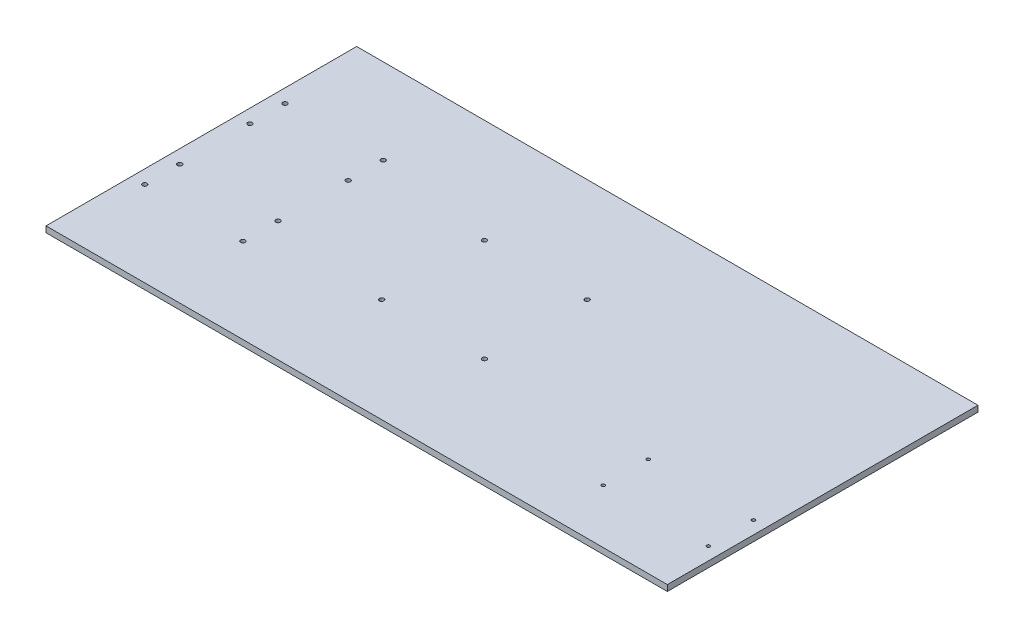
ISO-10303-21;
HEADER;
FILE_DESCRIPTION(('STEP AP214'),'2;1');
FILE_NAME('part.step','',(''),(''),'','','');
FILE_SCHEMA(('AUTOMOTIVE_DESIGN { 1 0 10303 214 1 1 1 1 }'));
ENDSEC;
DATA;
#1=APPLICATION_CONTEXT('core data for automotive mechanical design processes');
#2=APPLICATION_PROTOCOL_DEFINITION('international standard','automotive_design',2000,#1);
#3=PRODUCT_CONTEXT('',#1,'mechanical');
#4=PRODUCT('Part','Part','',(#3));
#5=PRODUCT_RELATED_PRODUCT_CATEGORY('part','',(#4));
#6=PRODUCT_DEFINITION_FORMATION('','',#4);
#7=PRODUCT_DEFINITION_CONTEXT('part definition',#1,'design');
#8=PRODUCT_DEFINITION('design','',#6,#7);
#9=PRODUCT_DEFINITION_SHAPE('','',#8);
#10=(LENGTH_UNIT() NAMED_UNIT(*) SI_UNIT(.MILLI.,.METRE.));
#11=(NAMED_UNIT(*) PLANE_ANGLE_UNIT() SI_UNIT($,.RADIAN.));
#12=(NAMED_UNIT(*) SI_UNIT($,.STERADIAN.) SOLID_ANGLE_UNIT());
#13=UNCERTAINTY_MEASURE_WITH_UNIT(LENGTH_MEASURE(1.E-05),#10,'distance_accuracy_value','');
#14=(GEOMETRIC_REPRESENTATION_CONTEXT(3) GLOBAL_UNCERTAINTY_ASSIGNED_CONTEXT((#13)) GLOBAL_UNIT_ASSIGNED_CONTEXT((#10,
#11,#12)) REPRESENTATION_CONTEXT('',''));
#15=CARTESIAN_POINT('',(0.,0.,0.));
#16=DIRECTION('',(0.,0.,1.));
#17=DIRECTION('',(1.,0.,0.));
#18=AXIS2_PLACEMENT_3D('',#15,#16,#17);
#19=CARTESIAN_POINT('',(-565.,12.,-310.));
#20=DIRECTION('',(1.,0.,0.));
#21=DIRECTION('',(0.,0.,-1.));
#22=AXIS2_PLACEMENT_3D('',#19,#20,#21);
#23=PLANE('',#22);
#24=DIRECTION('',(0.,0.,1.));
#25=VECTOR('',#24,1.);
#26=CARTESIAN_POINT('',(-565.,0.,-310.));
#27=LINE('',#26,#25);
#28=CARTESIAN_POINT('',(-565.,0.,-310.));
#29=VERTEX_POINT('',#28);
#30=CARTESIAN_POINT('',(-565.,0.,310.));
#31=VERTEX_POINT('',#30);
#32=EDGE_CURVE('E105',#29,#31,#27,.T.);
#33=ORIENTED_EDGE('',*,*,#32,.T.);
#34=DIRECTION('',(0.,-1.,0.));
#35=VECTOR('',#34,1.);
#36=CARTESIAN_POINT('',(-565.,12.,310.));
#37=LINE('',#36,#35);
#38=CARTESIAN_POINT('',(-565.,12.,310.));
#39=VERTEX_POINT('',#38);
#40=EDGE_CURVE('E11',#39,#31,#37,.T.);
#41=ORIENTED_EDGE('',*,*,#40,.F.);
#42=DIRECTION('',(0.,0.,1.));
#43=VECTOR('',#42,1.);
#44=CARTESIAN_POINT('',(-565.,12.,-310.));
#45=LINE('',#44,#43);
#46=CARTESIAN_POINT('',(-565.,12.,-310.));
#47=VERTEX_POINT('',#46);
#48=EDGE_CURVE('E92',#47,#39,#45,.T.);
#49=ORIENTED_EDGE('',*,*,#48,.F.);
#50=DIRECTION('',(0.,-1.,0.));
#51=VECTOR('',#50,1.);
#52=CARTESIAN_POINT('',(-565.,12.,-310.));
#53=LINE('',#52,#51);
#54=EDGE_CURVE('E101',#47,#29,#53,.T.);
#55=ORIENTED_EDGE('',*,*,#54,.T.);
#56=EDGE_LOOP('',(#33,#41,#49,#55));
#57=FACE_BOUND('',#56,.T.);
#58=ADVANCED_FACE('F39',(#57),#23,.F.);
#59=CARTESIAN_POINT('',(-565.,12.,310.));
#60=DIRECTION('',(0.,0.,-1.));
#61=DIRECTION('',(-1.,0.,0.));
#62=AXIS2_PLACEMENT_3D('',#59,#60,#61);
#63=PLANE('',#62);
#64=DIRECTION('',(1.,0.,0.));
#65=VECTOR('',#64,1.);
#66=CARTESIAN_POINT('',(-565.,0.,310.));
#67=LINE('',#66,#65);
#68=CARTESIAN_POINT('',(675.,0.,310.));
#69=VERTEX_POINT('',#68);
#70=EDGE_CURVE('E96',#31,#69,#67,.T.);
#71=ORIENTED_EDGE('',*,*,#70,.T.);
#72=DIRECTION('',(0.,-1.,0.));
#73=VECTOR('',#72,1.);
#74=CARTESIAN_POINT('',(675.,12.,310.));
#75=LINE('',#74,#73);
#76=CARTESIAN_POINT('',(675.,12.,310.));
#77=VERTEX_POINT('',#76);
#78=EDGE_CURVE('E48',#77,#69,#75,.T.);
#79=ORIENTED_EDGE('',*,*,#78,.F.);
#80=DIRECTION('',(1.,0.,0.));
#81=VECTOR('',#80,1.);
#82=CARTESIAN_POINT('',(-565.,12.,310.));
#83=LINE('',#82,#81);
#84=EDGE_CURVE('E87',#39,#77,#83,.T.);
#85=ORIENTED_EDGE('',*,*,#84,.F.);
#86=ORIENTED_EDGE('',*,*,#40,.T.);
#87=EDGE_LOOP('',(#71,#79,#85,#86));
#88=FACE_BOUND('',#87,.T.);
#89=ADVANCED_FACE('F95',(#88),#63,.F.);
#90=CARTESIAN_POINT('',(675.,12.,-310.));
#91=DIRECTION('',(-1.,0.,0.));
#92=DIRECTION('',(0.,0.,1.));
#93=AXIS2_PLACEMENT_3D('',#90,#91,#92);
#94=PLANE('',#93);
#95=DIRECTION('',(0.,0.,-1.));
#96=VECTOR('',#95,1.);
#97=CARTESIAN_POINT('',(675.,0.,-310.));
#98=LINE('',#97,#96);
#99=CARTESIAN_POINT('',(675.,0.,-310.));
#100=VERTEX_POINT('',#99);
#101=EDGE_CURVE('E74',#69,#100,#98,.T.);
#102=ORIENTED_EDGE('',*,*,#101,.T.);
#103=DIRECTION('',(0.,-1.,0.));
#104=VECTOR('',#103,1.);
#105=CARTESIAN_POINT('',(675.,12.,-310.));
#106=LINE('',#105,#104);
#107=CARTESIAN_POINT('',(675.,12.,-310.));
#108=VERTEX_POINT('',#107);
#109=EDGE_CURVE('E97',#108,#100,#106,.T.);
#110=ORIENTED_EDGE('',*,*,#109,.F.);
#111=DIRECTION('',(0.,0.,-1.));
#112=VECTOR('',#111,1.);
#113=CARTESIAN_POINT('',(675.,12.,-310.));
#114=LINE('',#113,#112);
#115=EDGE_CURVE('E90',#77,#108,#114,.T.);
#116=ORIENTED_EDGE('',*,*,#115,.F.);
#117=ORIENTED_EDGE('',*,*,#78,.T.);
#118=EDGE_LOOP('',(#102,#110,#116,#117));
#119=FACE_BOUND('',#118,.T.);
#120=ADVANCED_FACE('F99',(#119),#94,.F.);
#121=CARTESIAN_POINT('',(-565.,12.,-310.));
#122=DIRECTION('',(0.,0.,1.));
#123=DIRECTION('',(1.,0.,0.));
#124=AXIS2_PLACEMENT_3D('',#121,#122,#123);
#125=PLANE('',#124);
#126=DIRECTION('',(-1.,0.,0.));
#127=VECTOR('',#126,1.);
#128=CARTESIAN_POINT('',(-565.,0.,-310.));
#129=LINE('',#128,#127);
#130=EDGE_CURVE('E80',#100,#29,#129,.T.);
#131=ORIENTED_EDGE('',*,*,#130,.T.);
#132=ORIENTED_EDGE('',*,*,#54,.F.);
#133=DIRECTION('',(-1.,0.,0.));
#134=VECTOR('',#133,1.);
#135=CARTESIAN_POINT('',(-565.,12.,-310.));
#136=LINE('',#135,#134);
#137=EDGE_CURVE('E57',#108,#47,#136,.T.);
#138=ORIENTED_EDGE('',*,*,#137,.F.);
#139=ORIENTED_EDGE('',*,*,#109,.T.);
#140=EDGE_LOOP('',(#131,#132,#138,#139));
#141=FACE_BOUND('',#140,.T.);
#142=ADVANCED_FACE('F191',(#141),#125,.F.);
#143=CARTESIAN_POINT('',(0.,12.,0.));
#144=DIRECTION('',(0.,1.,0.));
#145=DIRECTION('',(0.,0.,1.));
#146=AXIS2_PLACEMENT_3D('',#143,#144,#145);
#147=PLANE('',#146);
#148=CARTESIAN_POINT('',(649.4,12.,202.513078806));
#149=DIRECTION('',(0.,1.,0.));
#150=DIRECTION('',(0.,0.,1.));
#151=AXIS2_PLACEMENT_3D('',#148,#149,#150);
#152=CIRCLE('',#151,3.29999999999998);
#153=CARTESIAN_POINT('',(649.4,12.,205.813078806));
#154=VERTEX_POINT('',#153);
#155=EDGE_CURVE('E377',#154,#154,#152,.T.);
#156=ORIENTED_EDGE('',*,*,#155,.F.);
#157=EDGE_LOOP('',(#156));
#158=FACE_BOUND('',#157,.T.);
#159=CARTESIAN_POINT('',(439.4,12.,112.513078806));
#160=DIRECTION('',(0.,1.,0.));
#161=DIRECTION('',(0.,0.,1.));
#162=AXIS2_PLACEMENT_3D('',#159,#160,#161);
#163=CIRCLE('',#162,3.30000000000003);
#164=CARTESIAN_POINT('',(439.4,12.,115.813078806));
#165=VERTEX_POINT('',#164);
#166=EDGE_CURVE('E381',#165,#165,#163,.T.);
#167=ORIENTED_EDGE('',*,*,#166,.F.);
#168=EDGE_LOOP('',(#167));
#169=FACE_BOUND('',#168,.T.);
#170=CARTESIAN_POINT('',(649.4,12.,112.513078806));
#171=DIRECTION('',(0.,1.,0.));
#172=DIRECTION('',(0.,0.,1.));
#173=AXIS2_PLACEMENT_3D('',#170,#171,#172);
#174=CIRCLE('',#173,3.29999999999998);
#175=CARTESIAN_POINT('',(649.4,12.,115.813078806));
#176=VERTEX_POINT('',#175);
#177=EDGE_CURVE('E392',#176,#176,#174,.T.);
#178=ORIENTED_EDGE('',*,*,#177,.F.);
#179=EDGE_LOOP('',(#178));
#180=FACE_BOUND('',#179,.T.);
#181=CARTESIAN_POINT('',(439.4,12.,202.513078806));
#182=DIRECTION('',(0.,1.,0.));
#183=DIRECTION('',(0.,0.,1.));
#184=AXIS2_PLACEMENT_3D('',#181,#182,#183);
#185=CIRCLE('',#184,3.30000000000003);
#186=CARTESIAN_POINT('',(439.4,12.,205.813078806));
#187=VERTEX_POINT('',#186);
#188=EDGE_CURVE('E378',#187,#187,#185,.T.);
#189=ORIENTED_EDGE('',*,*,#188,.F.);
#190=EDGE_LOOP('',(#189));
#191=FACE_BOUND('',#190,.T.);
#192=CARTESIAN_POINT('',(102.530483272049,12.,102.530483272049));
#193=DIRECTION('',(0.,1.,0.));
#194=DIRECTION('',(0.,0.,1.));
#195=AXIS2_PLACEMENT_3D('',#192,#193,#194);
#196=CIRCLE('',#195,4.5);
#197=CARTESIAN_POINT('',(102.530483272049,12.,107.030483272049));
#198=VERTEX_POINT('',#197);
#199=EDGE_CURVE('E136',#198,#198,#196,.T.);
#200=ORIENTED_EDGE('',*,*,#199,.F.);
#201=EDGE_LOOP('',(#200));
#202=FACE_BOUND('',#201,.T.);
#203=CARTESIAN_POINT('',(-102.530483272049,12.,102.530483272049));
#204=DIRECTION('',(0.,1.,0.));
#205=DIRECTION('',(0.,0.,1.));
#206=AXIS2_PLACEMENT_3D('',#203,#204,#205);
#207=CIRCLE('',#206,4.5);
#208=CARTESIAN_POINT('',(-102.530483272049,12.,107.030483272049));
#209=VERTEX_POINT('',#208);
#210=EDGE_CURVE('E124',#209,#209,#207,.T.);
#211=ORIENTED_EDGE('',*,*,#210,.F.);
#212=EDGE_LOOP('',(#211));
#213=FACE_BOUND('',#212,.T.);
#214=CARTESIAN_POINT('',(-102.530483272049,12.,-102.530483272049));
#215=DIRECTION('',(0.,1.,0.));
#216=DIRECTION('',(0.,0.,1.));
#217=AXIS2_PLACEMENT_3D('',#214,#215,#216);
#218=CIRCLE('',#217,4.5);
#219=CARTESIAN_POINT('',(-102.530483272049,12.,-98.0304832720494));
#220=VERTEX_POINT('',#219);
#221=EDGE_CURVE('E121',#220,#220,#218,.T.);
#222=ORIENTED_EDGE('',*,*,#221,.F.);
#223=EDGE_LOOP('',(#222));
#224=FACE_BOUND('',#223,.T.);
#225=CARTESIAN_POINT('',(102.530483272049,12.,-102.530483272049));
#226=DIRECTION('',(0.,1.,0.));
#227=DIRECTION('',(0.,0.,1.));
#228=AXIS2_PLACEMENT_3D('',#225,#226,#227);
#229=CIRCLE('',#228,4.5);
#230=CARTESIAN_POINT('',(102.530483272049,12.,-98.0304832720494));
#231=VERTEX_POINT('',#230);
#232=EDGE_CURVE('E117',#231,#231,#229,.T.);
#233=ORIENTED_EDGE('',*,*,#232,.F.);
#234=EDGE_LOOP('',(#233));
#235=FACE_BOUND('',#234,.T.);
#236=CARTESIAN_POINT('',(-342.,12.,-140.));
#237=DIRECTION('',(0.,1.,0.));
#238=DIRECTION('',(0.,0.,1.));
#239=AXIS2_PLACEMENT_3D('',#236,#237,#238);
#240=CIRCLE('',#239,4.5);
#241=CARTESIAN_POINT('',(-342.,12.,-135.5));
#242=VERTEX_POINT('',#241);
#243=EDGE_CURVE('E165',#242,#242,#240,.T.);
#244=ORIENTED_EDGE('',*,*,#243,.F.);
#245=EDGE_LOOP('',(#244));
#246=FACE_BOUND('',#245,.T.);
#247=CARTESIAN_POINT('',(-538.,12.,140.));
#248=DIRECTION('',(0.,1.,0.));
#249=DIRECTION('',(0.,0.,1.));
#250=AXIS2_PLACEMENT_3D('',#247,#248,#249);
#251=CIRCLE('',#250,4.49999999999995);
#252=CARTESIAN_POINT('',(-538.,12.,144.5));
#253=VERTEX_POINT('',#252);
#254=EDGE_CURVE('E158',#253,#253,#251,.T.);
#255=ORIENTED_EDGE('',*,*,#254,.F.);
#256=EDGE_LOOP('',(#255));
#257=FACE_BOUND('',#256,.T.);
#258=CARTESIAN_POINT('',(-538.,12.,70.));
#259=DIRECTION('',(0.,1.,0.));
#260=DIRECTION('',(0.,0.,1.));
#261=AXIS2_PLACEMENT_3D('',#258,#259,#260);
#262=CIRCLE('',#261,4.49999999999995);
#263=CARTESIAN_POINT('',(-538.,12.,74.5));
#264=VERTEX_POINT('',#263);
#265=EDGE_CURVE('E177',#264,#264,#262,.T.);
#266=ORIENTED_EDGE('',*,*,#265,.F.);
#267=EDGE_LOOP('',(#266));
#268=FACE_BOUND('',#267,.T.);
#269=CARTESIAN_POINT('',(-538.,12.,-70.));
#270=DIRECTION('',(0.,1.,0.));
#271=DIRECTION('',(0.,0.,1.));
#272=AXIS2_PLACEMENT_3D('',#269,#270,#271);
#273=CIRCLE('',#272,4.49999999999995);
#274=CARTESIAN_POINT('',(-538.,12.,-65.5000000000001));
#275=VERTEX_POINT('',#274);
#276=EDGE_CURVE('E170',#275,#275,#273,.T.);
#277=ORIENTED_EDGE('',*,*,#276,.F.);
#278=EDGE_LOOP('',(#277));
#279=FACE_BOUND('',#278,.T.);
#280=CARTESIAN_POINT('',(-342.,12.,-70.));
#281=DIRECTION('',(0.,1.,0.));
#282=DIRECTION('',(0.,0.,1.));
#283=AXIS2_PLACEMENT_3D('',#280,#281,#282);
#284=CIRCLE('',#283,4.5);
#285=CARTESIAN_POINT('',(-342.,12.,-65.5));
#286=VERTEX_POINT('',#285);
#287=EDGE_CURVE('E140',#286,#286,#284,.T.);
#288=ORIENTED_EDGE('',*,*,#287,.F.);
#289=EDGE_LOOP('',(#288));
#290=FACE_BOUND('',#289,.T.);
#291=CARTESIAN_POINT('',(-342.,12.,70.));
#292=DIRECTION('',(0.,1.,0.));
#293=DIRECTION('',(0.,0.,1.));
#294=AXIS2_PLACEMENT_3D('',#291,#292,#293);
#295=CIRCLE('',#294,4.5);
#296=CARTESIAN_POINT('',(-342.,12.,74.5));
#297=VERTEX_POINT('',#296);
#298=EDGE_CURVE('E147',#297,#297,#295,.T.);
#299=ORIENTED_EDGE('',*,*,#298,.F.);
#300=EDGE_LOOP('',(#299));
#301=FACE_BOUND('',#300,.T.);
#302=CARTESIAN_POINT('',(-342.,12.,140.));
#303=DIRECTION('',(0.,1.,0.));
#304=DIRECTION('',(0.,0.,1.));
#305=AXIS2_PLACEMENT_3D('',#302,#303,#304);
#306=CIRCLE('',#305,4.5);
#307=CARTESIAN_POINT('',(-342.,12.,144.5));
#308=VERTEX_POINT('',#307);
#309=EDGE_CURVE('E153',#308,#308,#306,.T.);
#310=ORIENTED_EDGE('',*,*,#309,.F.);
#311=EDGE_LOOP('',(#310));
#312=FACE_BOUND('',#311,.T.);
#313=CARTESIAN_POINT('',(-538.,12.,-140.));
#314=DIRECTION('',(0.,1.,0.));
#315=DIRECTION('',(0.,0.,1.));
#316=AXIS2_PLACEMENT_3D('',#313,#314,#315);
#317=CIRCLE('',#316,4.49999999999995);
#318=CARTESIAN_POINT('',(-538.,12.,-135.5));
#319=VERTEX_POINT('',#318);
#320=EDGE_CURVE('E173',#319,#319,#317,.T.);
#321=ORIENTED_EDGE('',*,*,#320,.F.);
#322=EDGE_LOOP('',(#321));
#323=FACE_BOUND('',#322,.T.);
#324=ORIENTED_EDGE('',*,*,#48,.T.);
#325=ORIENTED_EDGE('',*,*,#84,.T.);
#326=ORIENTED_EDGE('',*,*,#115,.T.);
#327=ORIENTED_EDGE('',*,*,#137,.T.);
#328=EDGE_LOOP('',(#324,#325,#326,#327));
#329=FACE_BOUND('',#328,.T.);
#330=ADVANCED_FACE('F88',(#158,#169,#180,#191,#202,#213,#224,#235,#246,#257,#268,#279,#290,#301,
#312,#323,#329),#147,.T.);
#331=CARTESIAN_POINT('',(0.,0.,0.));
#332=DIRECTION('',(0.,1.,0.));
#333=DIRECTION('',(0.,0.,1.));
#334=AXIS2_PLACEMENT_3D('',#331,#332,#333);
#335=PLANE('',#334);
#336=CARTESIAN_POINT('',(649.4,0.,202.513078806));
#337=DIRECTION('',(0.,1.,0.));
#338=DIRECTION('',(0.,0.,1.));
#339=AXIS2_PLACEMENT_3D('',#336,#337,#338);
#340=CIRCLE('',#339,3.29999999999998);
#341=CARTESIAN_POINT('',(649.4,0.,205.813078806));
#342=VERTEX_POINT('',#341);
#343=EDGE_CURVE('E375',#342,#342,#340,.T.);
#344=ORIENTED_EDGE('',*,*,#343,.T.);
#345=EDGE_LOOP('',(#344));
#346=FACE_BOUND('',#345,.T.);
#347=CARTESIAN_POINT('',(439.4,0.,112.513078806));
#348=DIRECTION('',(0.,1.,0.));
#349=DIRECTION('',(0.,0.,1.));
#350=AXIS2_PLACEMENT_3D('',#347,#348,#349);
#351=CIRCLE('',#350,3.30000000000003);
#352=CARTESIAN_POINT('',(439.4,0.,115.813078806));
#353=VERTEX_POINT('',#352);
#354=EDGE_CURVE('E389',#353,#353,#351,.T.);
#355=ORIENTED_EDGE('',*,*,#354,.T.);
#356=EDGE_LOOP('',(#355));
#357=FACE_BOUND('',#356,.T.);
#358=CARTESIAN_POINT('',(649.4,0.,112.513078806));
#359=DIRECTION('',(0.,1.,0.));
#360=DIRECTION('',(0.,0.,1.));
#361=AXIS2_PLACEMENT_3D('',#358,#359,#360);
#362=CIRCLE('',#361,3.29999999999998);
#363=CARTESIAN_POINT('',(649.4,0.,115.813078806));
#364=VERTEX_POINT('',#363);
#365=EDGE_CURVE('E384',#364,#364,#362,.T.);
#366=ORIENTED_EDGE('',*,*,#365,.T.);
#367=EDGE_LOOP('',(#366));
#368=FACE_BOUND('',#367,.T.);
#369=CARTESIAN_POINT('',(439.4,0.,202.513078806));
#370=DIRECTION('',(0.,1.,0.));
#371=DIRECTION('',(0.,0.,1.));
#372=AXIS2_PLACEMENT_3D('',#369,#370,#371);
#373=CIRCLE('',#372,3.30000000000003);
#374=CARTESIAN_POINT('',(439.4,0.,205.813078806));
#375=VERTEX_POINT('',#374);
#376=EDGE_CURVE('E118',#375,#375,#373,.T.);
#377=ORIENTED_EDGE('',*,*,#376,.T.);
#378=EDGE_LOOP('',(#377));
#379=FACE_BOUND('',#378,.T.);
#380=CARTESIAN_POINT('',(102.530483272049,0.,102.530483272049));
#381=DIRECTION('',(0.,1.,0.));
#382=DIRECTION('',(0.,0.,1.));
#383=AXIS2_PLACEMENT_3D('',#380,#381,#382);
#384=CIRCLE('',#383,4.5);
#385=CARTESIAN_POINT('',(102.530483272049,0.,107.030483272049));
#386=VERTEX_POINT('',#385);
#387=EDGE_CURVE('E42',#386,#386,#384,.T.);
#388=ORIENTED_EDGE('',*,*,#387,.T.);
#389=EDGE_LOOP('',(#388));
#390=FACE_BOUND('',#389,.T.);
#391=CARTESIAN_POINT('',(-102.530483272049,0.,102.530483272049));
#392=DIRECTION('',(0.,1.,0.));
#393=DIRECTION('',(0.,0.,1.));
#394=AXIS2_PLACEMENT_3D('',#391,#392,#393);
#395=CIRCLE('',#394,4.5);
#396=CARTESIAN_POINT('',(-102.530483272049,0.,107.030483272049));
#397=VERTEX_POINT('',#396);
#398=EDGE_CURVE('E122',#397,#397,#395,.T.);
#399=ORIENTED_EDGE('',*,*,#398,.T.);
#400=EDGE_LOOP('',(#399));
#401=FACE_BOUND('',#400,.T.);
#402=CARTESIAN_POINT('',(-102.530483272049,0.,-102.530483272049));
#403=DIRECTION('',(0.,1.,0.));
#404=DIRECTION('',(0.,0.,1.));
#405=AXIS2_PLACEMENT_3D('',#402,#403,#404);
#406=CIRCLE('',#405,4.5);
#407=CARTESIAN_POINT('',(-102.530483272049,0.,-98.0304832720494));
#408=VERTEX_POINT('',#407);
#409=EDGE_CURVE('E119',#408,#408,#406,.T.);
#410=ORIENTED_EDGE('',*,*,#409,.T.);
#411=EDGE_LOOP('',(#410));
#412=FACE_BOUND('',#411,.T.);
#413=CARTESIAN_POINT('',(102.530483272049,0.,-102.530483272049));
#414=DIRECTION('',(0.,1.,0.));
#415=DIRECTION('',(0.,0.,1.));
#416=AXIS2_PLACEMENT_3D('',#413,#414,#415);
#417=CIRCLE('',#416,4.5);
#418=CARTESIAN_POINT('',(102.530483272049,0.,-98.0304832720494));
#419=VERTEX_POINT('',#418);
#420=EDGE_CURVE('E114',#419,#419,#417,.T.);
#421=ORIENTED_EDGE('',*,*,#420,.T.);
#422=EDGE_LOOP('',(#421));
#423=FACE_BOUND('',#422,.T.);
#424=CARTESIAN_POINT('',(-342.,0.,-140.));
#425=DIRECTION('',(0.,1.,0.));
#426=DIRECTION('',(0.,0.,1.));
#427=AXIS2_PLACEMENT_3D('',#424,#425,#426);
#428=CIRCLE('',#427,4.5);
#429=CARTESIAN_POINT('',(-342.,0.,-135.5));
#430=VERTEX_POINT('',#429);
#431=EDGE_CURVE('E143',#430,#430,#428,.T.);
#432=ORIENTED_EDGE('',*,*,#431,.T.);
#433=EDGE_LOOP('',(#432));
#434=FACE_BOUND('',#433,.T.);
#435=CARTESIAN_POINT('',(-538.,0.,140.));
#436=DIRECTION('',(0.,1.,0.));
#437=DIRECTION('',(0.,0.,1.));
#438=AXIS2_PLACEMENT_3D('',#435,#436,#437);
#439=CIRCLE('',#438,4.49999999999995);
#440=CARTESIAN_POINT('',(-538.,0.,144.5));
#441=VERTEX_POINT('',#440);
#442=EDGE_CURVE('E162',#441,#441,#439,.T.);
#443=ORIENTED_EDGE('',*,*,#442,.T.);
#444=EDGE_LOOP('',(#443));
#445=FACE_BOUND('',#444,.T.);
#446=CARTESIAN_POINT('',(-538.,0.,70.));
#447=DIRECTION('',(0.,1.,0.));
#448=DIRECTION('',(0.,0.,1.));
#449=AXIS2_PLACEMENT_3D('',#446,#447,#448);
#450=CIRCLE('',#449,4.49999999999995);
#451=CARTESIAN_POINT('',(-538.,0.,74.5));
#452=VERTEX_POINT('',#451);
#453=EDGE_CURVE('E161',#452,#452,#450,.T.);
#454=ORIENTED_EDGE('',*,*,#453,.T.);
#455=EDGE_LOOP('',(#454));
#456=FACE_BOUND('',#455,.T.);
#457=CARTESIAN_POINT('',(-538.,0.,-70.));
#458=DIRECTION('',(0.,1.,0.));
#459=DIRECTION('',(0.,0.,1.));
#460=AXIS2_PLACEMENT_3D('',#457,#458,#459);
#461=CIRCLE('',#460,4.49999999999995);
#462=CARTESIAN_POINT('',(-538.,0.,-65.5000000000001));
#463=VERTEX_POINT('',#462);
#464=EDGE_CURVE('E174',#463,#463,#461,.T.);
#465=ORIENTED_EDGE('',*,*,#464,.T.);
#466=EDGE_LOOP('',(#465));
#467=FACE_BOUND('',#466,.T.);
#468=CARTESIAN_POINT('',(-342.,0.,-70.));
#469=DIRECTION('',(0.,1.,0.));
#470=DIRECTION('',(0.,0.,1.));
#471=AXIS2_PLACEMENT_3D('',#468,#469,#470);
#472=CIRCLE('',#471,4.5);
#473=CARTESIAN_POINT('',(-342.,0.,-65.5));
#474=VERTEX_POINT('',#473);
#475=EDGE_CURVE('E144',#474,#474,#472,.T.);
#476=ORIENTED_EDGE('',*,*,#475,.T.);
#477=EDGE_LOOP('',(#476));
#478=FACE_BOUND('',#477,.T.);
#479=CARTESIAN_POINT('',(-342.,0.,70.));
#480=DIRECTION('',(0.,1.,0.));
#481=DIRECTION('',(0.,0.,1.));
#482=AXIS2_PLACEMENT_3D('',#479,#480,#481);
#483=CIRCLE('',#482,4.5);
#484=CARTESIAN_POINT('',(-342.,0.,74.5));
#485=VERTEX_POINT('',#484);
#486=EDGE_CURVE('E150',#485,#485,#483,.T.);
#487=ORIENTED_EDGE('',*,*,#486,.T.);
#488=EDGE_LOOP('',(#487));
#489=FACE_BOUND('',#488,.T.);
#490=CARTESIAN_POINT('',(-342.,0.,140.));
#491=DIRECTION('',(0.,1.,0.));
#492=DIRECTION('',(0.,0.,1.));
#493=AXIS2_PLACEMENT_3D('',#490,#491,#492);
#494=CIRCLE('',#493,4.5);
#495=CARTESIAN_POINT('',(-342.,0.,144.5));
#496=VERTEX_POINT('',#495);
#497=EDGE_CURVE('E139',#496,#496,#494,.T.);
#498=ORIENTED_EDGE('',*,*,#497,.T.);
#499=EDGE_LOOP('',(#498));
#500=FACE_BOUND('',#499,.T.);
#501=CARTESIAN_POINT('',(-538.,0.,-140.));
#502=DIRECTION('',(0.,1.,0.));
#503=DIRECTION('',(0.,0.,1.));
#504=AXIS2_PLACEMENT_3D('',#501,#502,#503);
#505=CIRCLE('',#504,4.49999999999995);
#506=CARTESIAN_POINT('',(-538.,0.,-135.5));
#507=VERTEX_POINT('',#506);
#508=EDGE_CURVE('E108',#507,#507,#505,.T.);
#509=ORIENTED_EDGE('',*,*,#508,.T.);
#510=EDGE_LOOP('',(#509));
#511=FACE_BOUND('',#510,.T.);
#512=ORIENTED_EDGE('',*,*,#32,.F.);
#513=ORIENTED_EDGE('',*,*,#130,.F.);
#514=ORIENTED_EDGE('',*,*,#101,.F.);
#515=ORIENTED_EDGE('',*,*,#70,.F.);
#516=EDGE_LOOP('',(#512,#513,#514,#515));
#517=FACE_BOUND('',#516,.T.);
#518=ADVANCED_FACE('F190',(#346,#357,#368,#379,#390,#401,#412,#423,#434,#445,#456,#467,#478,
#489,#500,#511,#517),#335,.F.);
#519=CARTESIAN_POINT('',(-538.,0.,-140.));
#520=DIRECTION('',(0.,1.,0.));
#521=DIRECTION('',(0.,0.,1.));
#522=AXIS2_PLACEMENT_3D('',#519,#520,#521);
#523=CYLINDRICAL_SURFACE('',#522,4.49999999999995);
#524=ORIENTED_EDGE('',*,*,#508,.F.);
#525=EDGE_LOOP('',(#524));
#526=FACE_BOUND('',#525,.T.);
#527=ORIENTED_EDGE('',*,*,#320,.T.);
#528=EDGE_LOOP('',(#527));
#529=FACE_BOUND('',#528,.T.);
#530=ADVANCED_FACE('F187',(#526,#529),#523,.F.);
#531=CARTESIAN_POINT('',(-342.,0.,140.));
#532=DIRECTION('',(0.,1.,0.));
#533=DIRECTION('',(0.,0.,1.));
#534=AXIS2_PLACEMENT_3D('',#531,#532,#533);
#535=CYLINDRICAL_SURFACE('',#534,4.5);
#536=ORIENTED_EDGE('',*,*,#497,.F.);
#537=EDGE_LOOP('',(#536));
#538=FACE_BOUND('',#537,.T.);
#539=ORIENTED_EDGE('',*,*,#309,.T.);
#540=EDGE_LOOP('',(#539));
#541=FACE_BOUND('',#540,.T.);
#542=ADVANCED_FACE('F230',(#538,#541),#535,.F.);
#543=CARTESIAN_POINT('',(-342.,0.,70.));
#544=DIRECTION('',(0.,1.,0.));
#545=DIRECTION('',(0.,0.,1.));
#546=AXIS2_PLACEMENT_3D('',#543,#544,#545);
#547=CYLINDRICAL_SURFACE('',#546,4.5);
#548=ORIENTED_EDGE('',*,*,#486,.F.);
#549=EDGE_LOOP('',(#548));
#550=FACE_BOUND('',#549,.T.);
#551=ORIENTED_EDGE('',*,*,#298,.T.);
#552=EDGE_LOOP('',(#551));
#553=FACE_BOUND('',#552,.T.);
#554=ADVANCED_FACE('F239',(#550,#553),#547,.F.);
#555=CARTESIAN_POINT('',(-342.,0.,-70.));
#556=DIRECTION('',(0.,1.,0.));
#557=DIRECTION('',(0.,0.,1.));
#558=AXIS2_PLACEMENT_3D('',#555,#556,#557);
#559=CYLINDRICAL_SURFACE('',#558,4.5);
#560=ORIENTED_EDGE('',*,*,#475,.F.);
#561=EDGE_LOOP('',(#560));
#562=FACE_BOUND('',#561,.T.);
#563=ORIENTED_EDGE('',*,*,#287,.T.);
#564=EDGE_LOOP('',(#563));
#565=FACE_BOUND('',#564,.T.);
#566=ADVANCED_FACE('F248',(#562,#565),#559,.F.);
#567=CARTESIAN_POINT('',(-538.,0.,-70.));
#568=DIRECTION('',(0.,1.,0.));
#569=DIRECTION('',(0.,0.,1.));
#570=AXIS2_PLACEMENT_3D('',#567,#568,#569);
#571=CYLINDRICAL_SURFACE('',#570,4.49999999999995);
#572=ORIENTED_EDGE('',*,*,#464,.F.);
#573=EDGE_LOOP('',(#572));
#574=FACE_BOUND('',#573,.T.);
#575=ORIENTED_EDGE('',*,*,#276,.T.);
#576=EDGE_LOOP('',(#575));
#577=FACE_BOUND('',#576,.T.);
#578=ADVANCED_FACE('F257',(#574,#577),#571,.F.);
#579=CARTESIAN_POINT('',(-538.,0.,70.));
#580=DIRECTION('',(0.,1.,0.));
#581=DIRECTION('',(0.,0.,1.));
#582=AXIS2_PLACEMENT_3D('',#579,#580,#581);
#583=CYLINDRICAL_SURFACE('',#582,4.49999999999995);
#584=ORIENTED_EDGE('',*,*,#453,.F.);
#585=EDGE_LOOP('',(#584));
#586=FACE_BOUND('',#585,.T.);
#587=ORIENTED_EDGE('',*,*,#265,.T.);
#588=EDGE_LOOP('',(#587));
#589=FACE_BOUND('',#588,.T.);
#590=ADVANCED_FACE('F266',(#586,#589),#583,.F.);
#591=CARTESIAN_POINT('',(-538.,0.,140.));
#592=DIRECTION('',(0.,1.,0.));
#593=DIRECTION('',(0.,0.,1.));
#594=AXIS2_PLACEMENT_3D('',#591,#592,#593);
#595=CYLINDRICAL_SURFACE('',#594,4.49999999999995);
#596=ORIENTED_EDGE('',*,*,#442,.F.);
#597=EDGE_LOOP('',(#596));
#598=FACE_BOUND('',#597,.T.);
#599=ORIENTED_EDGE('',*,*,#254,.T.);
#600=EDGE_LOOP('',(#599));
#601=FACE_BOUND('',#600,.T.);
#602=ADVANCED_FACE('F275',(#598,#601),#595,.F.);
#603=CARTESIAN_POINT('',(-342.,0.,-140.));
#604=DIRECTION('',(0.,1.,0.));
#605=DIRECTION('',(0.,0.,1.));
#606=AXIS2_PLACEMENT_3D('',#603,#604,#605);
#607=CYLINDRICAL_SURFACE('',#606,4.5);
#608=ORIENTED_EDGE('',*,*,#431,.F.);
#609=EDGE_LOOP('',(#608));
#610=FACE_BOUND('',#609,.T.);
#611=ORIENTED_EDGE('',*,*,#243,.T.);
#612=EDGE_LOOP('',(#611));
#613=FACE_BOUND('',#612,.T.);
#614=ADVANCED_FACE('F284',(#610,#613),#607,.F.);
#615=CARTESIAN_POINT('',(102.530483272049,-8.,-102.530483272049));
#616=DIRECTION('',(0.,1.,0.));
#617=DIRECTION('',(0.,0.,1.));
#618=AXIS2_PLACEMENT_3D('',#615,#616,#617);
#619=CYLINDRICAL_SURFACE('',#618,4.5);
#620=ORIENTED_EDGE('',*,*,#232,.T.);
#621=EDGE_LOOP('',(#620));
#622=FACE_BOUND('',#621,.T.);
#623=ORIENTED_EDGE('',*,*,#420,.F.);
#624=EDGE_LOOP('',(#623));
#625=FACE_BOUND('',#624,.T.);
#626=ADVANCED_FACE('F293',(#622,#625),#619,.F.);
#627=CARTESIAN_POINT('',(-102.530483272049,-8.,-102.530483272049));
#628=DIRECTION('',(0.,1.,0.));
#629=DIRECTION('',(0.,0.,1.));
#630=AXIS2_PLACEMENT_3D('',#627,#628,#629);
#631=CYLINDRICAL_SURFACE('',#630,4.5);
#632=ORIENTED_EDGE('',*,*,#221,.T.);
#633=EDGE_LOOP('',(#632));
#634=FACE_BOUND('',#633,.T.);
#635=ORIENTED_EDGE('',*,*,#409,.F.);
#636=EDGE_LOOP('',(#635));
#637=FACE_BOUND('',#636,.T.);
#638=ADVANCED_FACE('F302',(#634,#637),#631,.F.);
#639=CARTESIAN_POINT('',(-102.530483272049,-8.,102.530483272049));
#640=DIRECTION('',(0.,1.,0.));
#641=DIRECTION('',(0.,0.,1.));
#642=AXIS2_PLACEMENT_3D('',#639,#640,#641);
#643=CYLINDRICAL_SURFACE('',#642,4.5);
#644=ORIENTED_EDGE('',*,*,#210,.T.);
#645=EDGE_LOOP('',(#644));
#646=FACE_BOUND('',#645,.T.);
#647=ORIENTED_EDGE('',*,*,#398,.F.);
#648=EDGE_LOOP('',(#647));
#649=FACE_BOUND('',#648,.T.);
#650=ADVANCED_FACE('F311',(#646,#649),#643,.F.);
#651=CARTESIAN_POINT('',(102.530483272049,-8.,102.530483272049));
#652=DIRECTION('',(0.,1.,0.));
#653=DIRECTION('',(0.,0.,1.));
#654=AXIS2_PLACEMENT_3D('',#651,#652,#653);
#655=CYLINDRICAL_SURFACE('',#654,4.5);
#656=ORIENTED_EDGE('',*,*,#199,.T.);
#657=EDGE_LOOP('',(#656));
#658=FACE_BOUND('',#657,.T.);
#659=ORIENTED_EDGE('',*,*,#387,.F.);
#660=EDGE_LOOP('',(#659));
#661=FACE_BOUND('',#660,.T.);
#662=ADVANCED_FACE('F318',(#658,#661),#655,.F.);
#663=CARTESIAN_POINT('',(439.4,0.,202.513078806));
#664=DIRECTION('',(0.,1.,0.));
#665=DIRECTION('',(0.,0.,1.));
#666=AXIS2_PLACEMENT_3D('',#663,#664,#665);
#667=CYLINDRICAL_SURFACE('',#666,3.30000000000003);
#668=ORIENTED_EDGE('',*,*,#376,.F.);
#669=EDGE_LOOP('',(#668));
#670=FACE_BOUND('',#669,.T.);
#671=ORIENTED_EDGE('',*,*,#188,.T.);
#672=EDGE_LOOP('',(#671));
#673=FACE_BOUND('',#672,.T.);
#674=ADVANCED_FACE('F326',(#670,#673),#667,.F.);
#675=CARTESIAN_POINT('',(649.4,0.,112.513078806));
#676=DIRECTION('',(0.,1.,0.));
#677=DIRECTION('',(0.,0.,1.));
#678=AXIS2_PLACEMENT_3D('',#675,#676,#677);
#679=CYLINDRICAL_SURFACE('',#678,3.29999999999998);
#680=ORIENTED_EDGE('',*,*,#365,.F.);
#681=EDGE_LOOP('',(#680));
#682=FACE_BOUND('',#681,.T.);
#683=ORIENTED_EDGE('',*,*,#177,.T.);
#684=EDGE_LOOP('',(#683));
#685=FACE_BOUND('',#684,.T.);
#686=ADVANCED_FACE('F339',(#682,#685),#679,.F.);
#687=CARTESIAN_POINT('',(439.4,0.,112.513078806));
#688=DIRECTION('',(0.,1.,0.));
#689=DIRECTION('',(0.,0.,1.));
#690=AXIS2_PLACEMENT_3D('',#687,#688,#689);
#691=CYLINDRICAL_SURFACE('',#690,3.30000000000003);
#692=ORIENTED_EDGE('',*,*,#354,.F.);
#693=EDGE_LOOP('',(#692));
#694=FACE_BOUND('',#693,.T.);
#695=ORIENTED_EDGE('',*,*,#166,.T.);
#696=EDGE_LOOP('',(#695));
#697=FACE_BOUND('',#696,.T.);
#698=ADVANCED_FACE('F349',(#694,#697),#691,.F.);
#699=CARTESIAN_POINT('',(649.4,0.,202.513078806));
#700=DIRECTION('',(0.,1.,0.));
#701=DIRECTION('',(0.,0.,1.));
#702=AXIS2_PLACEMENT_3D('',#699,#700,#701);
#703=CYLINDRICAL_SURFACE('',#702,3.29999999999998);
#704=ORIENTED_EDGE('',*,*,#343,.F.);
#705=EDGE_LOOP('',(#704));
#706=FACE_BOUND('',#705,.T.);
#707=ORIENTED_EDGE('',*,*,#155,.T.);
#708=EDGE_LOOP('',(#707));
#709=FACE_BOUND('',#708,.T.);
#710=ADVANCED_FACE('F359',(#706,#709),#703,.F.);
#711=CLOSED_SHELL('',(#58,#89,#120,#142,#330,#518,#530,#542,#554,#566,#578,#590,#602,#614,#626,
#638,#650,#662,#674,#686,#698,#710));
#712=MANIFOLD_SOLID_BREP('B2',#711);
#713=ADVANCED_BREP_SHAPE_REPRESENTATION('',(#18,#712),#14);
#714=SHAPE_DEFINITION_REPRESENTATION(#9,#713);
ENDSEC;
END-ISO-10303-21;
